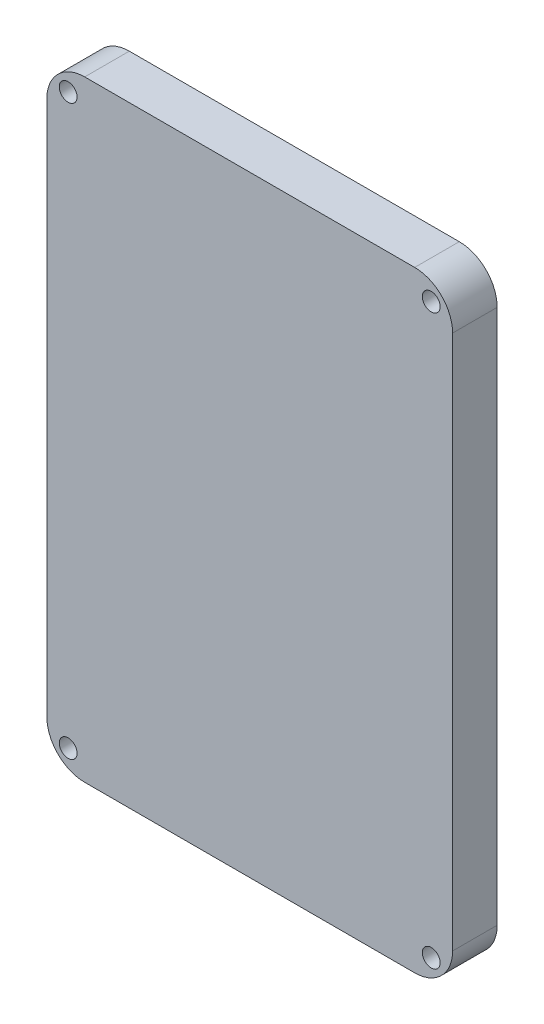
ISO-10303-21;
HEADER;
FILE_DESCRIPTION(('STEP AP214'),'2;1');
FILE_NAME('part.step','',(''),(''),'','','');
FILE_SCHEMA(('AUTOMOTIVE_DESIGN { 1 0 10303 214 1 1 1 1 }'));
ENDSEC;
DATA;
#1=APPLICATION_CONTEXT('core data for automotive mechanical design processes');
#2=APPLICATION_PROTOCOL_DEFINITION('international standard','automotive_design',2000,#1);
#3=PRODUCT_CONTEXT('',#1,'mechanical');
#4=PRODUCT('Part','Part','',(#3));
#5=PRODUCT_RELATED_PRODUCT_CATEGORY('part','',(#4));
#6=PRODUCT_DEFINITION_FORMATION('','',#4);
#7=PRODUCT_DEFINITION_CONTEXT('part definition',#1,'design');
#8=PRODUCT_DEFINITION('design','',#6,#7);
#9=PRODUCT_DEFINITION_SHAPE('','',#8);
#10=(LENGTH_UNIT() NAMED_UNIT(*) SI_UNIT(.MILLI.,.METRE.));
#11=(NAMED_UNIT(*) PLANE_ANGLE_UNIT() SI_UNIT($,.RADIAN.));
#12=(NAMED_UNIT(*) SI_UNIT($,.STERADIAN.) SOLID_ANGLE_UNIT());
#13=UNCERTAINTY_MEASURE_WITH_UNIT(LENGTH_MEASURE(1.E-05),#10,'distance_accuracy_value','');
#14=(GEOMETRIC_REPRESENTATION_CONTEXT(3) GLOBAL_UNCERTAINTY_ASSIGNED_CONTEXT((#13)) GLOBAL_UNIT_ASSIGNED_CONTEXT((#10,
#11,#12)) REPRESENTATION_CONTEXT('',''));
#15=CARTESIAN_POINT('',(0.,0.,0.));
#16=DIRECTION('',(0.,0.,1.));
#17=DIRECTION('',(1.,0.,0.));
#18=AXIS2_PLACEMENT_3D('',#15,#16,#17);
#19=CARTESIAN_POINT('',(37.,60.,10.));
#20=DIRECTION('',(0.,0.,-1.));
#21=DIRECTION('',(-1.,0.,0.));
#22=AXIS2_PLACEMENT_3D('',#19,#20,#21);
#23=CYLINDRICAL_SURFACE('',#22,8.5);
#24=CARTESIAN_POINT('',(37.,60.,0.));
#25=DIRECTION('',(0.,0.,1.));
#26=DIRECTION('',(1.,0.,0.));
#27=AXIS2_PLACEMENT_3D('',#24,#25,#26);
#28=CIRCLE('',#27,8.5);
#29=CARTESIAN_POINT('',(45.5,59.9999999999999,0.));
#30=VERTEX_POINT('',#29);
#31=CARTESIAN_POINT('',(37.,68.5,0.));
#32=VERTEX_POINT('',#31);
#33=EDGE_CURVE('E144',#30,#32,#28,.T.);
#34=ORIENTED_EDGE('',*,*,#33,.T.);
#35=DIRECTION('',(0.,0.,-1.));
#36=VECTOR('',#35,1.);
#37=CARTESIAN_POINT('',(37.,68.5,10.));
#38=LINE('',#37,#36);
#39=CARTESIAN_POINT('',(37.,68.5,10.));
#40=VERTEX_POINT('',#39);
#41=EDGE_CURVE('E11',#40,#32,#38,.T.);
#42=ORIENTED_EDGE('',*,*,#41,.F.);
#43=CARTESIAN_POINT('',(37.,60.,10.));
#44=DIRECTION('',(0.,0.,1.));
#45=DIRECTION('',(1.,0.,0.));
#46=AXIS2_PLACEMENT_3D('',#43,#44,#45);
#47=CIRCLE('',#46,8.5);
#48=CARTESIAN_POINT('',(45.5,59.9999999999999,10.));
#49=VERTEX_POINT('',#48);
#50=EDGE_CURVE('E158',#49,#40,#47,.T.);
#51=ORIENTED_EDGE('',*,*,#50,.F.);
#52=DIRECTION('',(0.,0.,-1.));
#53=VECTOR('',#52,1.);
#54=CARTESIAN_POINT('',(45.5,59.9999999999999,10.));
#55=LINE('',#54,#53);
#56=EDGE_CURVE('E139',#49,#30,#55,.T.);
#57=ORIENTED_EDGE('',*,*,#56,.T.);
#58=EDGE_LOOP('',(#34,#42,#51,#57));
#59=FACE_BOUND('',#58,.T.);
#60=ADVANCED_FACE('F37',(#59),#23,.T.);
#61=CARTESIAN_POINT('',(37.,68.5,10.));
#62=DIRECTION('',(0.,-1.,0.));
#63=DIRECTION('',(0.,0.,-1.));
#64=AXIS2_PLACEMENT_3D('',#61,#62,#63);
#65=PLANE('',#64);
#66=DIRECTION('',(-1.,0.,0.));
#67=VECTOR('',#66,1.);
#68=CARTESIAN_POINT('',(37.,68.5,0.));
#69=LINE('',#68,#67);
#70=CARTESIAN_POINT('',(-36.9999999999999,68.5,0.));
#71=VERTEX_POINT('',#70);
#72=EDGE_CURVE('E150',#32,#71,#69,.T.);
#73=ORIENTED_EDGE('',*,*,#72,.T.);
#74=DIRECTION('',(0.,0.,-1.));
#75=VECTOR('',#74,1.);
#76=CARTESIAN_POINT('',(-36.9999999999999,68.5,10.));
#77=LINE('',#76,#75);
#78=CARTESIAN_POINT('',(-36.9999999999999,68.5,10.));
#79=VERTEX_POINT('',#78);
#80=EDGE_CURVE('E51',#79,#71,#77,.T.);
#81=ORIENTED_EDGE('',*,*,#80,.F.);
#82=DIRECTION('',(-1.,0.,0.));
#83=VECTOR('',#82,1.);
#84=CARTESIAN_POINT('',(37.,68.5,10.));
#85=LINE('',#84,#83);
#86=EDGE_CURVE('E104',#40,#79,#85,.T.);
#87=ORIENTED_EDGE('',*,*,#86,.F.);
#88=ORIENTED_EDGE('',*,*,#41,.T.);
#89=EDGE_LOOP('',(#73,#81,#87,#88));
#90=FACE_BOUND('',#89,.T.);
#91=ADVANCED_FACE('F395',(#90),#65,.F.);
#92=CARTESIAN_POINT('',(-37.,60.,10.));
#93=DIRECTION('',(0.,0.,-1.));
#94=DIRECTION('',(-1.,0.,0.));
#95=AXIS2_PLACEMENT_3D('',#92,#93,#94);
#96=CYLINDRICAL_SURFACE('',#95,8.5);
#97=CARTESIAN_POINT('',(-37.,60.,0.));
#98=DIRECTION('',(0.,0.,1.));
#99=DIRECTION('',(-1.,0.,0.));
#100=AXIS2_PLACEMENT_3D('',#97,#98,#99);
#101=CIRCLE('',#100,8.5);
#102=CARTESIAN_POINT('',(-45.5,59.9999999999999,0.));
#103=VERTEX_POINT('',#102);
#104=EDGE_CURVE('E149',#71,#103,#101,.T.);
#105=ORIENTED_EDGE('',*,*,#104,.T.);
#106=DIRECTION('',(0.,0.,-1.));
#107=VECTOR('',#106,1.);
#108=CARTESIAN_POINT('',(-45.5,59.9999999999999,10.));
#109=LINE('',#108,#107);
#110=CARTESIAN_POINT('',(-45.5,59.9999999999999,10.));
#111=VERTEX_POINT('',#110);
#112=EDGE_CURVE('E168',#111,#103,#109,.T.);
#113=ORIENTED_EDGE('',*,*,#112,.F.);
#114=CARTESIAN_POINT('',(-37.,60.,10.));
#115=DIRECTION('',(0.,0.,1.));
#116=DIRECTION('',(-1.,0.,0.));
#117=AXIS2_PLACEMENT_3D('',#114,#115,#116);
#118=CIRCLE('',#117,8.5);
#119=EDGE_CURVE('E370',#79,#111,#118,.T.);
#120=ORIENTED_EDGE('',*,*,#119,.F.);
#121=ORIENTED_EDGE('',*,*,#80,.T.);
#122=EDGE_LOOP('',(#105,#113,#120,#121));
#123=FACE_BOUND('',#122,.T.);
#124=ADVANCED_FACE('F400',(#123),#96,.T.);
#125=CARTESIAN_POINT('',(-45.5,-60.,10.));
#126=DIRECTION('',(1.,0.,0.));
#127=DIRECTION('',(0.,0.,-1.));
#128=AXIS2_PLACEMENT_3D('',#125,#126,#127);
#129=PLANE('',#128);
#130=DIRECTION('',(0.,-1.,0.));
#131=VECTOR('',#130,1.);
#132=CARTESIAN_POINT('',(-45.5,-60.,0.));
#133=LINE('',#132,#131);
#134=CARTESIAN_POINT('',(-45.5,-60.,0.));
#135=VERTEX_POINT('',#134);
#136=EDGE_CURVE('E151',#103,#135,#133,.T.);
#137=ORIENTED_EDGE('',*,*,#136,.T.);
#138=DIRECTION('',(0.,0.,-1.));
#139=VECTOR('',#138,1.);
#140=CARTESIAN_POINT('',(-45.5,-60.,10.));
#141=LINE('',#140,#139);
#142=CARTESIAN_POINT('',(-45.5,-60.,10.));
#143=VERTEX_POINT('',#142);
#144=EDGE_CURVE('E161',#143,#135,#141,.T.);
#145=ORIENTED_EDGE('',*,*,#144,.F.);
#146=DIRECTION('',(0.,-1.,0.));
#147=VECTOR('',#146,1.);
#148=CARTESIAN_POINT('',(-45.5,-60.,10.));
#149=LINE('',#148,#147);
#150=EDGE_CURVE('E367',#111,#143,#149,.T.);
#151=ORIENTED_EDGE('',*,*,#150,.F.);
#152=ORIENTED_EDGE('',*,*,#112,.T.);
#153=EDGE_LOOP('',(#137,#145,#151,#152));
#154=FACE_BOUND('',#153,.T.);
#155=ADVANCED_FACE('F374',(#154),#129,.F.);
#156=CARTESIAN_POINT('',(-37.,-60.,10.));
#157=DIRECTION('',(0.,0.,-1.));
#158=DIRECTION('',(-1.,0.,0.));
#159=AXIS2_PLACEMENT_3D('',#156,#157,#158);
#160=CYLINDRICAL_SURFACE('',#159,8.5);
#161=CARTESIAN_POINT('',(-37.,-60.,0.));
#162=DIRECTION('',(0.,0.,1.));
#163=DIRECTION('',(-1.,0.,0.));
#164=AXIS2_PLACEMENT_3D('',#161,#162,#163);
#165=CIRCLE('',#164,8.5);
#166=CARTESIAN_POINT('',(-36.9999999999999,-68.5,0.));
#167=VERTEX_POINT('',#166);
#168=EDGE_CURVE('E153',#135,#167,#165,.T.);
#169=ORIENTED_EDGE('',*,*,#168,.T.);
#170=DIRECTION('',(0.,0.,-1.));
#171=VECTOR('',#170,1.);
#172=CARTESIAN_POINT('',(-36.9999999999999,-68.5,10.));
#173=LINE('',#172,#171);
#174=CARTESIAN_POINT('',(-36.9999999999999,-68.5,10.));
#175=VERTEX_POINT('',#174);
#176=EDGE_CURVE('E132',#175,#167,#173,.T.);
#177=ORIENTED_EDGE('',*,*,#176,.F.);
#178=CARTESIAN_POINT('',(-37.,-60.,10.));
#179=DIRECTION('',(0.,0.,1.));
#180=DIRECTION('',(-1.,0.,0.));
#181=AXIS2_PLACEMENT_3D('',#178,#179,#180);
#182=CIRCLE('',#181,8.5);
#183=EDGE_CURVE('E126',#143,#175,#182,.T.);
#184=ORIENTED_EDGE('',*,*,#183,.F.);
#185=ORIENTED_EDGE('',*,*,#144,.T.);
#186=EDGE_LOOP('',(#169,#177,#184,#185));
#187=FACE_BOUND('',#186,.T.);
#188=ADVANCED_FACE('F378',(#187),#160,.T.);
#189=CARTESIAN_POINT('',(37.,-68.5,10.));
#190=DIRECTION('',(0.,1.,0.));
#191=DIRECTION('',(0.,0.,1.));
#192=AXIS2_PLACEMENT_3D('',#189,#190,#191);
#193=PLANE('',#192);
#194=DIRECTION('',(1.,0.,0.));
#195=VECTOR('',#194,1.);
#196=CARTESIAN_POINT('',(37.,-68.5,0.));
#197=LINE('',#196,#195);
#198=CARTESIAN_POINT('',(37.,-68.5,0.));
#199=VERTEX_POINT('',#198);
#200=EDGE_CURVE('E133',#167,#199,#197,.T.);
#201=ORIENTED_EDGE('',*,*,#200,.T.);
#202=DIRECTION('',(0.,0.,-1.));
#203=VECTOR('',#202,1.);
#204=CARTESIAN_POINT('',(37.,-68.5,10.));
#205=LINE('',#204,#203);
#206=CARTESIAN_POINT('',(37.,-68.5,10.));
#207=VERTEX_POINT('',#206);
#208=EDGE_CURVE('E134',#207,#199,#205,.T.);
#209=ORIENTED_EDGE('',*,*,#208,.F.);
#210=DIRECTION('',(1.,0.,0.));
#211=VECTOR('',#210,1.);
#212=CARTESIAN_POINT('',(37.,-68.5,10.));
#213=LINE('',#212,#211);
#214=EDGE_CURVE('E119',#175,#207,#213,.T.);
#215=ORIENTED_EDGE('',*,*,#214,.F.);
#216=ORIENTED_EDGE('',*,*,#176,.T.);
#217=EDGE_LOOP('',(#201,#209,#215,#216));
#218=FACE_BOUND('',#217,.T.);
#219=ADVANCED_FACE('F131',(#218),#193,.F.);
#220=CARTESIAN_POINT('',(37.,-60.,10.));
#221=DIRECTION('',(0.,0.,-1.));
#222=DIRECTION('',(-1.,0.,0.));
#223=AXIS2_PLACEMENT_3D('',#220,#221,#222);
#224=CYLINDRICAL_SURFACE('',#223,8.5);
#225=CARTESIAN_POINT('',(37.,-60.,0.));
#226=DIRECTION('',(0.,0.,1.));
#227=DIRECTION('',(-1.,0.,0.));
#228=AXIS2_PLACEMENT_3D('',#225,#226,#227);
#229=CIRCLE('',#228,8.5);
#230=CARTESIAN_POINT('',(45.5,-60.,0.));
#231=VERTEX_POINT('',#230);
#232=EDGE_CURVE('E87',#199,#231,#229,.T.);
#233=ORIENTED_EDGE('',*,*,#232,.T.);
#234=DIRECTION('',(0.,0.,-1.));
#235=VECTOR('',#234,1.);
#236=CARTESIAN_POINT('',(45.5,-60.,10.));
#237=LINE('',#236,#235);
#238=CARTESIAN_POINT('',(45.5,-60.,10.));
#239=VERTEX_POINT('',#238);
#240=EDGE_CURVE('E136',#239,#231,#237,.T.);
#241=ORIENTED_EDGE('',*,*,#240,.F.);
#242=CARTESIAN_POINT('',(37.,-60.,10.));
#243=DIRECTION('',(0.,0.,1.));
#244=DIRECTION('',(-1.,0.,0.));
#245=AXIS2_PLACEMENT_3D('',#242,#243,#244);
#246=CIRCLE('',#245,8.5);
#247=EDGE_CURVE('E121',#207,#239,#246,.T.);
#248=ORIENTED_EDGE('',*,*,#247,.F.);
#249=ORIENTED_EDGE('',*,*,#208,.T.);
#250=EDGE_LOOP('',(#233,#241,#248,#249));
#251=FACE_BOUND('',#250,.T.);
#252=ADVANCED_FACE('F137',(#251),#224,.T.);
#253=CARTESIAN_POINT('',(45.5,-60.,10.));
#254=DIRECTION('',(-1.,0.,0.));
#255=DIRECTION('',(0.,-1.,0.));
#256=AXIS2_PLACEMENT_3D('',#253,#254,#255);
#257=PLANE('',#256);
#258=DIRECTION('',(0.,1.,0.));
#259=VECTOR('',#258,1.);
#260=CARTESIAN_POINT('',(45.5,-60.,0.));
#261=LINE('',#260,#259);
#262=EDGE_CURVE('E98',#231,#30,#261,.T.);
#263=ORIENTED_EDGE('',*,*,#262,.T.);
#264=ORIENTED_EDGE('',*,*,#56,.F.);
#265=DIRECTION('',(0.,1.,0.));
#266=VECTOR('',#265,1.);
#267=CARTESIAN_POINT('',(45.5,-60.,10.));
#268=LINE('',#267,#266);
#269=EDGE_CURVE('E58',#239,#49,#268,.T.);
#270=ORIENTED_EDGE('',*,*,#269,.F.);
#271=ORIENTED_EDGE('',*,*,#240,.T.);
#272=EDGE_LOOP('',(#263,#264,#270,#271));
#273=FACE_BOUND('',#272,.T.);
#274=ADVANCED_FACE('F191',(#273),#257,.F.);
#275=CARTESIAN_POINT('',(37.,60.,10.));
#276=DIRECTION('',(0.,0.,1.));
#277=DIRECTION('',(1.,0.,0.));
#278=AXIS2_PLACEMENT_3D('',#275,#276,#277);
#279=PLANE('',#278);
#280=CARTESIAN_POINT('',(-40.7123106012294,-63.7123106012294,10.000012));
#281=DIRECTION('',(0.,0.,1.));
#282=DIRECTION('',(-1.,0.,0.));
#283=AXIS2_PLACEMENT_3D('',#280,#281,#282);
#284=CIRCLE('',#283,2.00000000000001);
#285=CARTESIAN_POINT('',(-42.7123106012294,-63.7123106012294,10.000012));
#286=VERTEX_POINT('',#285);
#287=EDGE_CURVE('E221',#286,#286,#284,.T.);
#288=ORIENTED_EDGE('',*,*,#287,.F.);
#289=EDGE_LOOP('',(#288));
#290=FACE_BOUND('',#289,.T.);
#291=CARTESIAN_POINT('',(40.7123106012294,63.7123106012294,10.000012));
#292=DIRECTION('',(0.,0.,1.));
#293=DIRECTION('',(-1.,0.,0.));
#294=AXIS2_PLACEMENT_3D('',#291,#292,#293);
#295=CIRCLE('',#294,2.);
#296=CARTESIAN_POINT('',(38.7123106012294,63.7123106012294,10.000012));
#297=VERTEX_POINT('',#296);
#298=EDGE_CURVE('E211',#297,#297,#295,.T.);
#299=ORIENTED_EDGE('',*,*,#298,.F.);
#300=EDGE_LOOP('',(#299));
#301=FACE_BOUND('',#300,.T.);
#302=CARTESIAN_POINT('',(40.7123106012294,-63.7123106012294,10.000012));
#303=DIRECTION('',(0.,0.,1.));
#304=DIRECTION('',(1.,0.,0.));
#305=AXIS2_PLACEMENT_3D('',#302,#303,#304);
#306=CIRCLE('',#305,2.00000000000001);
#307=CARTESIAN_POINT('',(42.7123106012294,-63.7123106012294,10.000012));
#308=VERTEX_POINT('',#307);
#309=EDGE_CURVE('E236',#308,#308,#306,.T.);
#310=ORIENTED_EDGE('',*,*,#309,.F.);
#311=EDGE_LOOP('',(#310));
#312=FACE_BOUND('',#311,.T.);
#313=CARTESIAN_POINT('',(-40.7123106012294,63.7123106012294,10.000012));
#314=DIRECTION('',(0.,0.,1.));
#315=DIRECTION('',(1.,0.,0.));
#316=AXIS2_PLACEMENT_3D('',#313,#314,#315);
#317=CIRCLE('',#316,2.);
#318=CARTESIAN_POINT('',(-38.7123106012294,63.7123106012294,10.000012));
#319=VERTEX_POINT('',#318);
#320=EDGE_CURVE('E174',#319,#319,#317,.T.);
#321=ORIENTED_EDGE('',*,*,#320,.F.);
#322=EDGE_LOOP('',(#321));
#323=FACE_BOUND('',#322,.T.);
#324=ORIENTED_EDGE('',*,*,#50,.T.);
#325=ORIENTED_EDGE('',*,*,#86,.T.);
#326=ORIENTED_EDGE('',*,*,#119,.T.);
#327=ORIENTED_EDGE('',*,*,#150,.T.);
#328=ORIENTED_EDGE('',*,*,#183,.T.);
#329=ORIENTED_EDGE('',*,*,#214,.T.);
#330=ORIENTED_EDGE('',*,*,#247,.T.);
#331=ORIENTED_EDGE('',*,*,#269,.T.);
#332=EDGE_LOOP('',(#324,#325,#326,#327,#328,#329,#330,#331));
#333=FACE_BOUND('',#332,.T.);
#334=ADVANCED_FACE('F125',(#290,#301,#312,#323,#333),#279,.T.);
#335=CARTESIAN_POINT('',(37.,60.,0.));
#336=DIRECTION('',(0.,0.,1.));
#337=DIRECTION('',(1.,0.,0.));
#338=AXIS2_PLACEMENT_3D('',#335,#336,#337);
#339=PLANE('',#338);
#340=CARTESIAN_POINT('',(-40.7123106012294,-63.7123106012294,0.));
#341=DIRECTION('',(0.,0.,1.));
#342=DIRECTION('',(-1.,0.,0.));
#343=AXIS2_PLACEMENT_3D('',#340,#341,#342);
#344=CIRCLE('',#343,2.00000000000001);
#345=CARTESIAN_POINT('',(-42.7123106012294,-63.7123106012294,0.));
#346=VERTEX_POINT('',#345);
#347=EDGE_CURVE('E223',#346,#346,#344,.T.);
#348=ORIENTED_EDGE('',*,*,#347,.T.);
#349=EDGE_LOOP('',(#348));
#350=FACE_BOUND('',#349,.T.);
#351=CARTESIAN_POINT('',(40.7123106012294,63.7123106012294,0.));
#352=DIRECTION('',(0.,0.,1.));
#353=DIRECTION('',(-1.,0.,0.));
#354=AXIS2_PLACEMENT_3D('',#351,#352,#353);
#355=CIRCLE('',#354,2.);
#356=CARTESIAN_POINT('',(38.7123106012294,63.7123106012294,0.));
#357=VERTEX_POINT('',#356);
#358=EDGE_CURVE('E229',#357,#357,#355,.T.);
#359=ORIENTED_EDGE('',*,*,#358,.T.);
#360=EDGE_LOOP('',(#359));
#361=FACE_BOUND('',#360,.T.);
#362=CARTESIAN_POINT('',(40.7123106012294,-63.7123106012294,0.));
#363=DIRECTION('',(0.,0.,1.));
#364=DIRECTION('',(1.,0.,0.));
#365=AXIS2_PLACEMENT_3D('',#362,#363,#364);
#366=CIRCLE('',#365,2.00000000000001);
#367=CARTESIAN_POINT('',(42.7123106012294,-63.7123106012294,0.));
#368=VERTEX_POINT('',#367);
#369=EDGE_CURVE('E231',#368,#368,#366,.T.);
#370=ORIENTED_EDGE('',*,*,#369,.T.);
#371=EDGE_LOOP('',(#370));
#372=FACE_BOUND('',#371,.T.);
#373=CARTESIAN_POINT('',(-40.7123106012294,63.7123106012294,0.));
#374=DIRECTION('',(0.,0.,1.));
#375=DIRECTION('',(1.,0.,0.));
#376=AXIS2_PLACEMENT_3D('',#373,#374,#375);
#377=CIRCLE('',#376,2.);
#378=CARTESIAN_POINT('',(-38.7123106012294,63.7123106012294,0.));
#379=VERTEX_POINT('',#378);
#380=EDGE_CURVE('E224',#379,#379,#377,.T.);
#381=ORIENTED_EDGE('',*,*,#380,.T.);
#382=EDGE_LOOP('',(#381));
#383=FACE_BOUND('',#382,.T.);
#384=ORIENTED_EDGE('',*,*,#33,.F.);
#385=ORIENTED_EDGE('',*,*,#262,.F.);
#386=ORIENTED_EDGE('',*,*,#232,.F.);
#387=ORIENTED_EDGE('',*,*,#200,.F.);
#388=ORIENTED_EDGE('',*,*,#168,.F.);
#389=ORIENTED_EDGE('',*,*,#136,.F.);
#390=ORIENTED_EDGE('',*,*,#104,.F.);
#391=ORIENTED_EDGE('',*,*,#72,.F.);
#392=EDGE_LOOP('',(#384,#385,#386,#387,#388,#389,#390,#391));
#393=FACE_BOUND('',#392,.T.);
#394=ADVANCED_FACE('F188',(#350,#361,#372,#383,#393),#339,.F.);
#395=CARTESIAN_POINT('',(-40.7123106012294,63.7123106012294,0.));
#396=DIRECTION('',(0.,0.,1.));
#397=DIRECTION('',(1.,0.,0.));
#398=AXIS2_PLACEMENT_3D('',#395,#396,#397);
#399=CYLINDRICAL_SURFACE('',#398,2.);
#400=ORIENTED_EDGE('',*,*,#380,.F.);
#401=EDGE_LOOP('',(#400));
#402=FACE_BOUND('',#401,.T.);
#403=ORIENTED_EDGE('',*,*,#320,.T.);
#404=EDGE_LOOP('',(#403));
#405=FACE_BOUND('',#404,.T.);
#406=ADVANCED_FACE('F265',(#402,#405),#399,.F.);
#407=CARTESIAN_POINT('',(40.7123106012294,-63.7123106012294,0.));
#408=DIRECTION('',(0.,0.,1.));
#409=DIRECTION('',(1.,0.,0.));
#410=AXIS2_PLACEMENT_3D('',#407,#408,#409);
#411=CYLINDRICAL_SURFACE('',#410,2.00000000000001);
#412=ORIENTED_EDGE('',*,*,#369,.F.);
#413=EDGE_LOOP('',(#412));
#414=FACE_BOUND('',#413,.T.);
#415=ORIENTED_EDGE('',*,*,#309,.T.);
#416=EDGE_LOOP('',(#415));
#417=FACE_BOUND('',#416,.T.);
#418=ADVANCED_FACE('F260',(#414,#417),#411,.F.);
#419=CARTESIAN_POINT('',(40.7123106012294,63.7123106012294,0.));
#420=DIRECTION('',(0.,0.,1.));
#421=DIRECTION('',(1.,0.,0.));
#422=AXIS2_PLACEMENT_3D('',#419,#420,#421);
#423=CYLINDRICAL_SURFACE('',#422,2.);
#424=ORIENTED_EDGE('',*,*,#358,.F.);
#425=EDGE_LOOP('',(#424));
#426=FACE_BOUND('',#425,.T.);
#427=ORIENTED_EDGE('',*,*,#298,.T.);
#428=EDGE_LOOP('',(#427));
#429=FACE_BOUND('',#428,.T.);
#430=ADVANCED_FACE('F253',(#426,#429),#423,.F.);
#431=CARTESIAN_POINT('',(-40.7123106012294,-63.7123106012294,0.));
#432=DIRECTION('',(0.,0.,1.));
#433=DIRECTION('',(1.,0.,0.));
#434=AXIS2_PLACEMENT_3D('',#431,#432,#433);
#435=CYLINDRICAL_SURFACE('',#434,2.00000000000001);
#436=ORIENTED_EDGE('',*,*,#347,.F.);
#437=EDGE_LOOP('',(#436));
#438=FACE_BOUND('',#437,.T.);
#439=ORIENTED_EDGE('',*,*,#287,.T.);
#440=EDGE_LOOP('',(#439));
#441=FACE_BOUND('',#440,.T.);
#442=ADVANCED_FACE('F244',(#438,#441),#435,.F.);
#443=CLOSED_SHELL('',(#60,#91,#124,#155,#188,#219,#252,#274,#334,#394,#406,#418,#430,#442));
#444=CARTESIAN_POINT('',(-37.,-60.,5.));
#445=DIRECTION('',(0.,0.,1.));
#446=DIRECTION('',(1.,0.,0.));
#447=AXIS2_PLACEMENT_3D('',#444,#445,#446);
#448=CYLINDRICAL_SURFACE('',#447,1.99999999999999);
#449=CARTESIAN_POINT('',(-37.,-60.,8.));
#450=DIRECTION('',(0.,0.,-1.));
#451=DIRECTION('',(-1.,0.,0.));
#452=AXIS2_PLACEMENT_3D('',#449,#450,#451);
#453=CIRCLE('',#452,1.99999999999999);
#454=CARTESIAN_POINT('',(-37.,-62.,8.));
#455=VERTEX_POINT('',#454);
#456=CARTESIAN_POINT('',(-39.,-60.,8.));
#457=VERTEX_POINT('',#456);
#458=EDGE_CURVE('E238',#455,#457,#453,.T.);
#459=ORIENTED_EDGE('',*,*,#458,.F.);
#460=DIRECTION('',(0.,0.,1.));
#461=VECTOR('',#460,1.);
#462=CARTESIAN_POINT('',(-37.,-62.,5.));
#463=LINE('',#462,#461);
#464=CARTESIAN_POINT('',(-37.,-62.,5.));
#465=VERTEX_POINT('',#464);
#466=EDGE_CURVE('E318',#465,#455,#463,.T.);
#467=ORIENTED_EDGE('',*,*,#466,.F.);
#468=CARTESIAN_POINT('',(-37.,-60.,5.));
#469=DIRECTION('',(0.,0.,-1.));
#470=DIRECTION('',(-1.,0.,0.));
#471=AXIS2_PLACEMENT_3D('',#468,#469,#470);
#472=CIRCLE('',#471,1.99999999999999);
#473=CARTESIAN_POINT('',(-39.,-60.,5.));
#474=VERTEX_POINT('',#473);
#475=EDGE_CURVE('E289',#465,#474,#472,.T.);
#476=ORIENTED_EDGE('',*,*,#475,.T.);
#477=DIRECTION('',(0.,0.,1.));
#478=VECTOR('',#477,1.);
#479=CARTESIAN_POINT('',(-39.,-60.,5.));
#480=LINE('',#479,#478);
#481=EDGE_CURVE('E147',#474,#457,#480,.T.);
#482=ORIENTED_EDGE('',*,*,#481,.T.);
#483=EDGE_LOOP('',(#459,#467,#476,#482));
#484=FACE_BOUND('',#483,.T.);
#485=ADVANCED_FACE('F192',(#484),#448,.F.);
#486=CARTESIAN_POINT('',(-39.,-60.,5.));
#487=DIRECTION('',(1.,0.,0.));
#488=DIRECTION('',(0.,0.,-1.));
#489=AXIS2_PLACEMENT_3D('',#486,#487,#488);
#490=PLANE('',#489);
#491=DIRECTION('',(0.,1.,0.));
#492=VECTOR('',#491,1.);
#493=CARTESIAN_POINT('',(-39.,-60.,8.));
#494=LINE('',#493,#492);
#495=CARTESIAN_POINT('',(-39.,60.,8.));
#496=VERTEX_POINT('',#495);
#497=EDGE_CURVE('E322',#457,#496,#494,.T.);
#498=ORIENTED_EDGE('',*,*,#497,.F.);
#499=ORIENTED_EDGE('',*,*,#481,.F.);
#500=DIRECTION('',(0.,1.,0.));
#501=VECTOR('',#500,1.);
#502=CARTESIAN_POINT('',(-39.,-60.,5.));
#503=LINE('',#502,#501);
#504=CARTESIAN_POINT('',(-39.,60.,5.));
#505=VERTEX_POINT('',#504);
#506=EDGE_CURVE('E296',#474,#505,#503,.T.);
#507=ORIENTED_EDGE('',*,*,#506,.T.);
#508=DIRECTION('',(0.,0.,1.));
#509=VECTOR('',#508,1.);
#510=CARTESIAN_POINT('',(-39.,60.,5.));
#511=LINE('',#510,#509);
#512=EDGE_CURVE('E359',#505,#496,#511,.T.);
#513=ORIENTED_EDGE('',*,*,#512,.T.);
#514=EDGE_LOOP('',(#498,#499,#507,#513));
#515=FACE_BOUND('',#514,.T.);
#516=ADVANCED_FACE('F447',(#515),#490,.T.);
#517=CARTESIAN_POINT('',(-37.,60.,5.));
#518=DIRECTION('',(0.,0.,1.));
#519=DIRECTION('',(1.,0.,0.));
#520=AXIS2_PLACEMENT_3D('',#517,#518,#519);
#521=CYLINDRICAL_SURFACE('',#520,2.);
#522=CARTESIAN_POINT('',(-37.,60.,8.));
#523=DIRECTION('',(0.,0.,-1.));
#524=DIRECTION('',(-1.,0.,0.));
#525=AXIS2_PLACEMENT_3D('',#522,#523,#524);
#526=CIRCLE('',#525,2.);
#527=CARTESIAN_POINT('',(-37.,62.,8.));
#528=VERTEX_POINT('',#527);
#529=EDGE_CURVE('E329',#496,#528,#526,.T.);
#530=ORIENTED_EDGE('',*,*,#529,.F.);
#531=ORIENTED_EDGE('',*,*,#512,.F.);
#532=CARTESIAN_POINT('',(-37.,60.,5.));
#533=DIRECTION('',(0.,0.,-1.));
#534=DIRECTION('',(-1.,0.,0.));
#535=AXIS2_PLACEMENT_3D('',#532,#533,#534);
#536=CIRCLE('',#535,2.);
#537=CARTESIAN_POINT('',(-37.,62.,5.));
#538=VERTEX_POINT('',#537);
#539=EDGE_CURVE('E305',#505,#538,#536,.T.);
#540=ORIENTED_EDGE('',*,*,#539,.T.);
#541=DIRECTION('',(0.,0.,1.));
#542=VECTOR('',#541,1.);
#543=CARTESIAN_POINT('',(-37.,62.,5.));
#544=LINE('',#543,#542);
#545=EDGE_CURVE('E357',#538,#528,#544,.T.);
#546=ORIENTED_EDGE('',*,*,#545,.T.);
#547=EDGE_LOOP('',(#530,#531,#540,#546));
#548=FACE_BOUND('',#547,.T.);
#549=ADVANCED_FACE('F459',(#548),#521,.F.);
#550=CARTESIAN_POINT('',(-37.,62.,5.));
#551=DIRECTION('',(0.,-1.,0.));
#552=DIRECTION('',(0.,0.,-1.));
#553=AXIS2_PLACEMENT_3D('',#550,#551,#552);
#554=PLANE('',#553);
#555=DIRECTION('',(1.,0.,0.));
#556=VECTOR('',#555,1.);
#557=CARTESIAN_POINT('',(-37.,62.,8.));
#558=LINE('',#557,#556);
#559=CARTESIAN_POINT('',(37.,62.,8.));
#560=VERTEX_POINT('',#559);
#561=EDGE_CURVE('E328',#528,#560,#558,.T.);
#562=ORIENTED_EDGE('',*,*,#561,.F.);
#563=ORIENTED_EDGE('',*,*,#545,.F.);
#564=DIRECTION('',(1.,0.,0.));
#565=VECTOR('',#564,1.);
#566=CARTESIAN_POINT('',(-37.,62.,5.));
#567=LINE('',#566,#565);
#568=CARTESIAN_POINT('',(37.,62.,5.));
#569=VERTEX_POINT('',#568);
#570=EDGE_CURVE('E304',#538,#569,#567,.T.);
#571=ORIENTED_EDGE('',*,*,#570,.T.);
#572=DIRECTION('',(0.,0.,1.));
#573=VECTOR('',#572,1.);
#574=CARTESIAN_POINT('',(37.,62.,5.));
#575=LINE('',#574,#573);
#576=EDGE_CURVE('E353',#569,#560,#575,.T.);
#577=ORIENTED_EDGE('',*,*,#576,.T.);
#578=EDGE_LOOP('',(#562,#563,#571,#577));
#579=FACE_BOUND('',#578,.T.);
#580=ADVANCED_FACE('F464',(#579),#554,.T.);
#581=CARTESIAN_POINT('',(37.,60.,5.));
#582=DIRECTION('',(0.,0.,1.));
#583=DIRECTION('',(1.,0.,0.));
#584=AXIS2_PLACEMENT_3D('',#581,#582,#583);
#585=CYLINDRICAL_SURFACE('',#584,2.);
#586=CARTESIAN_POINT('',(37.,60.,8.));
#587=DIRECTION('',(0.,0.,-1.));
#588=DIRECTION('',(-1.,0.,0.));
#589=AXIS2_PLACEMENT_3D('',#586,#587,#588);
#590=CIRCLE('',#589,2.);
#591=CARTESIAN_POINT('',(39.,60.,8.));
#592=VERTEX_POINT('',#591);
#593=EDGE_CURVE('E335',#560,#592,#590,.T.);
#594=ORIENTED_EDGE('',*,*,#593,.F.);
#595=ORIENTED_EDGE('',*,*,#576,.F.);
#596=CARTESIAN_POINT('',(37.,60.,5.));
#597=DIRECTION('',(0.,0.,-1.));
#598=DIRECTION('',(-1.,0.,0.));
#599=AXIS2_PLACEMENT_3D('',#596,#597,#598);
#600=CIRCLE('',#599,2.);
#601=CARTESIAN_POINT('',(39.,60.,5.));
#602=VERTEX_POINT('',#601);
#603=EDGE_CURVE('E308',#569,#602,#600,.T.);
#604=ORIENTED_EDGE('',*,*,#603,.T.);
#605=DIRECTION('',(0.,0.,1.));
#606=VECTOR('',#605,1.);
#607=CARTESIAN_POINT('',(39.,60.,5.));
#608=LINE('',#607,#606);
#609=EDGE_CURVE('E351',#602,#592,#608,.T.);
#610=ORIENTED_EDGE('',*,*,#609,.T.);
#611=EDGE_LOOP('',(#594,#595,#604,#610));
#612=FACE_BOUND('',#611,.T.);
#613=ADVANCED_FACE('F474',(#612),#585,.F.);
#614=CARTESIAN_POINT('',(39.,-60.,5.));
#615=DIRECTION('',(1.,0.,0.));
#616=DIRECTION('',(0.,0.,-1.));
#617=AXIS2_PLACEMENT_3D('',#614,#615,#616);
#618=PLANE('',#617);
#619=DIRECTION('',(0.,1.,0.));
#620=VECTOR('',#619,1.);
#621=CARTESIAN_POINT('',(39.,-60.,8.));
#622=LINE('',#621,#620);
#623=CARTESIAN_POINT('',(39.,-60.,8.));
#624=VERTEX_POINT('',#623);
#625=EDGE_CURVE('E334',#624,#592,#622,.T.);
#626=ORIENTED_EDGE('',*,*,#625,.T.);
#627=ORIENTED_EDGE('',*,*,#609,.F.);
#628=DIRECTION('',(0.,1.,0.));
#629=VECTOR('',#628,1.);
#630=CARTESIAN_POINT('',(39.,-60.,5.));
#631=LINE('',#630,#629);
#632=CARTESIAN_POINT('',(39.,-60.,5.));
#633=VERTEX_POINT('',#632);
#634=EDGE_CURVE('E311',#633,#602,#631,.T.);
#635=ORIENTED_EDGE('',*,*,#634,.F.);
#636=DIRECTION('',(0.,0.,1.));
#637=VECTOR('',#636,1.);
#638=CARTESIAN_POINT('',(39.,-60.,5.));
#639=LINE('',#638,#637);
#640=EDGE_CURVE('E350',#633,#624,#639,.T.);
#641=ORIENTED_EDGE('',*,*,#640,.T.);
#642=EDGE_LOOP('',(#626,#627,#635,#641));
#643=FACE_BOUND('',#642,.T.);
#644=ADVANCED_FACE('F484',(#643),#618,.F.);
#645=CARTESIAN_POINT('',(37.,-60.,5.));
#646=DIRECTION('',(0.,0.,1.));
#647=DIRECTION('',(1.,0.,0.));
#648=AXIS2_PLACEMENT_3D('',#645,#646,#647);
#649=CYLINDRICAL_SURFACE('',#648,2.);
#650=CARTESIAN_POINT('',(37.,-60.,8.));
#651=DIRECTION('',(0.,0.,1.));
#652=DIRECTION('',(1.,0.,0.));
#653=AXIS2_PLACEMENT_3D('',#650,#651,#652);
#654=CIRCLE('',#653,2.);
#655=CARTESIAN_POINT('',(37.,-62.,8.));
#656=VERTEX_POINT('',#655);
#657=EDGE_CURVE('E336',#656,#624,#654,.T.);
#658=ORIENTED_EDGE('',*,*,#657,.T.);
#659=ORIENTED_EDGE('',*,*,#640,.F.);
#660=CARTESIAN_POINT('',(37.,-60.,5.));
#661=DIRECTION('',(0.,0.,1.));
#662=DIRECTION('',(1.,0.,0.));
#663=AXIS2_PLACEMENT_3D('',#660,#661,#662);
#664=CIRCLE('',#663,2.);
#665=CARTESIAN_POINT('',(37.,-62.,5.));
#666=VERTEX_POINT('',#665);
#667=EDGE_CURVE('E313',#666,#633,#664,.T.);
#668=ORIENTED_EDGE('',*,*,#667,.F.);
#669=DIRECTION('',(0.,0.,1.));
#670=VECTOR('',#669,1.);
#671=CARTESIAN_POINT('',(37.,-62.,5.));
#672=LINE('',#671,#670);
#673=EDGE_CURVE('E344',#666,#656,#672,.T.);
#674=ORIENTED_EDGE('',*,*,#673,.T.);
#675=EDGE_LOOP('',(#658,#659,#668,#674));
#676=FACE_BOUND('',#675,.T.);
#677=ADVANCED_FACE('F492',(#676),#649,.F.);
#678=CARTESIAN_POINT('',(-37.,-62.,5.));
#679=DIRECTION('',(0.,-1.,0.));
#680=DIRECTION('',(1.,0.,0.));
#681=AXIS2_PLACEMENT_3D('',#678,#679,#680);
#682=PLANE('',#681);
#683=DIRECTION('',(1.,0.,0.));
#684=VECTOR('',#683,1.);
#685=CARTESIAN_POINT('',(-37.,-62.,8.));
#686=LINE('',#685,#684);
#687=EDGE_CURVE('E299',#455,#656,#686,.T.);
#688=ORIENTED_EDGE('',*,*,#687,.T.);
#689=ORIENTED_EDGE('',*,*,#673,.F.);
#690=DIRECTION('',(1.,0.,0.));
#691=VECTOR('',#690,1.);
#692=CARTESIAN_POINT('',(-37.,-62.,5.));
#693=LINE('',#692,#691);
#694=EDGE_CURVE('E320',#465,#666,#693,.T.);
#695=ORIENTED_EDGE('',*,*,#694,.F.);
#696=ORIENTED_EDGE('',*,*,#466,.T.);
#697=EDGE_LOOP('',(#688,#689,#695,#696));
#698=FACE_BOUND('',#697,.T.);
#699=ADVANCED_FACE('F504',(#698),#682,.F.);
#700=CARTESIAN_POINT('',(-37.,-60.,5.));
#701=DIRECTION('',(0.,0.,-1.));
#702=DIRECTION('',(-1.,0.,0.));
#703=AXIS2_PLACEMENT_3D('',#700,#701,#702);
#704=PLANE('',#703);
#705=ORIENTED_EDGE('',*,*,#475,.F.);
#706=ORIENTED_EDGE('',*,*,#694,.T.);
#707=ORIENTED_EDGE('',*,*,#667,.T.);
#708=ORIENTED_EDGE('',*,*,#634,.T.);
#709=ORIENTED_EDGE('',*,*,#603,.F.);
#710=ORIENTED_EDGE('',*,*,#570,.F.);
#711=ORIENTED_EDGE('',*,*,#539,.F.);
#712=ORIENTED_EDGE('',*,*,#506,.F.);
#713=EDGE_LOOP('',(#705,#706,#707,#708,#709,#710,#711,#712));
#714=FACE_BOUND('',#713,.T.);
#715=ADVANCED_FACE('F513',(#714),#704,.F.);
#716=CARTESIAN_POINT('',(-37.,-60.,8.));
#717=DIRECTION('',(0.,0.,-1.));
#718=DIRECTION('',(-1.,0.,0.));
#719=AXIS2_PLACEMENT_3D('',#716,#717,#718);
#720=PLANE('',#719);
#721=ORIENTED_EDGE('',*,*,#458,.T.);
#722=ORIENTED_EDGE('',*,*,#497,.T.);
#723=ORIENTED_EDGE('',*,*,#529,.T.);
#724=ORIENTED_EDGE('',*,*,#561,.T.);
#725=ORIENTED_EDGE('',*,*,#593,.T.);
#726=ORIENTED_EDGE('',*,*,#625,.F.);
#727=ORIENTED_EDGE('',*,*,#657,.F.);
#728=ORIENTED_EDGE('',*,*,#687,.F.);
#729=EDGE_LOOP('',(#721,#722,#723,#724,#725,#726,#727,#728));
#730=FACE_BOUND('',#729,.T.);
#731=ADVANCED_FACE('F522',(#730),#720,.T.);
#732=CLOSED_SHELL('',(#485,#516,#549,#580,#613,#644,#677,#699,#715,#731));
#733=ORIENTED_CLOSED_SHELL('',*,#732,.T.);
#734=BREP_WITH_VOIDS('B2',#443,(#733));
#735=ADVANCED_BREP_SHAPE_REPRESENTATION('',(#18,#734),#14);
#736=SHAPE_DEFINITION_REPRESENTATION(#9,#735);
ENDSEC;
END-ISO-10303-21;
